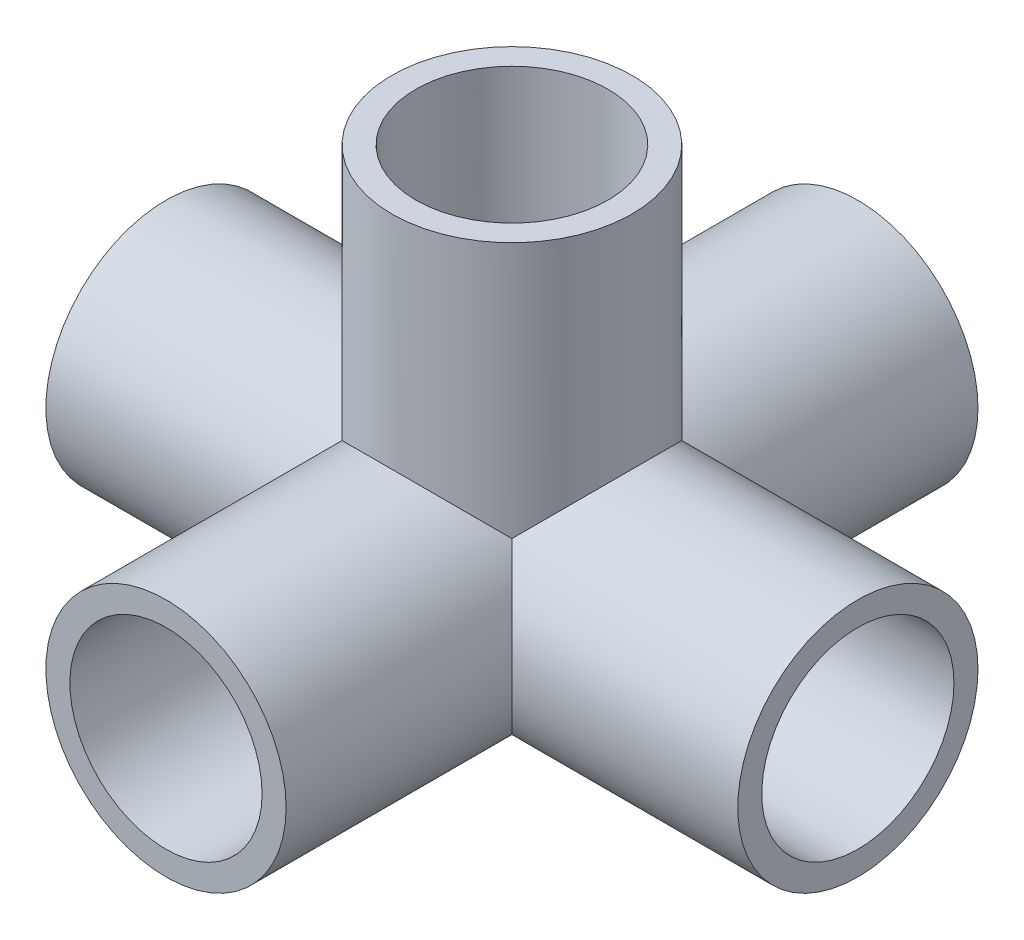
ISO-10303-21;
HEADER;
FILE_DESCRIPTION(('STEP AP214'),'2;1');
FILE_NAME('part.step','',(''),(''),'','','');
FILE_SCHEMA(('AUTOMOTIVE_DESIGN { 1 0 10303 214 1 1 1 1 }'));
ENDSEC;
DATA;
#1=APPLICATION_CONTEXT('core data for automotive mechanical design processes');
#2=APPLICATION_PROTOCOL_DEFINITION('international standard','automotive_design',2000,#1);
#3=PRODUCT_CONTEXT('',#1,'mechanical');
#4=PRODUCT('Part','Part','',(#3));
#5=PRODUCT_RELATED_PRODUCT_CATEGORY('part','',(#4));
#6=PRODUCT_DEFINITION_FORMATION('','',#4);
#7=PRODUCT_DEFINITION_CONTEXT('part definition',#1,'design');
#8=PRODUCT_DEFINITION('design','',#6,#7);
#9=PRODUCT_DEFINITION_SHAPE('','',#8);
#10=(LENGTH_UNIT() NAMED_UNIT(*) SI_UNIT(.MILLI.,.METRE.));
#11=(NAMED_UNIT(*) PLANE_ANGLE_UNIT() SI_UNIT($,.RADIAN.));
#12=(NAMED_UNIT(*) SI_UNIT($,.STERADIAN.) SOLID_ANGLE_UNIT());
#13=UNCERTAINTY_MEASURE_WITH_UNIT(LENGTH_MEASURE(1.E-05),#10,'distance_accuracy_value','');
#14=(GEOMETRIC_REPRESENTATION_CONTEXT(3) GLOBAL_UNCERTAINTY_ASSIGNED_CONTEXT((#13)) GLOBAL_UNIT_ASSIGNED_CONTEXT((#10,
#11,#12)) REPRESENTATION_CONTEXT('',''));
#15=CARTESIAN_POINT('',(0.,0.,0.));
#16=DIRECTION('',(0.,0.,1.));
#17=DIRECTION('',(1.,0.,0.));
#18=AXIS2_PLACEMENT_3D('',#15,#16,#17);
#19=CARTESIAN_POINT('',(36.,0.,0.));
#20=DIRECTION('',(-1.,0.,0.));
#21=DIRECTION('',(0.,0.,1.));
#22=AXIS2_PLACEMENT_3D('',#19,#20,#21);
#23=CYLINDRICAL_SURFACE('',#22,12.5);
#24=CARTESIAN_POINT('',(-36.,0.,0.));
#25=DIRECTION('',(1.,0.,0.));
#26=DIRECTION('',(0.,0.,-1.));
#27=AXIS2_PLACEMENT_3D('',#24,#25,#26);
#28=CIRCLE('',#27,12.5);
#29=CARTESIAN_POINT('',(-36.,0.,-12.5));
#30=VERTEX_POINT('',#29);
#31=EDGE_CURVE('E132',#30,#30,#28,.T.);
#32=ORIENTED_EDGE('',*,*,#31,.T.);
#33=EDGE_LOOP('',(#32));
#34=FACE_BOUND('',#33,.T.);
#35=CARTESIAN_POINT('',(0.,0.,0.));
#36=DIRECTION('',(-0.707106781186547,0.,-0.707106781186547));
#37=DIRECTION('',(-0.707106781186547,0.,0.707106781186547));
#38=AXIS2_PLACEMENT_3D('',#35,#36,#37);
#39=ELLIPSE('',#38,17.6776695296637,12.5);
#40=CARTESIAN_POINT('',(-8.83883476483184,8.83883476483184,8.83883476483184));
#41=VERTEX_POINT('',#40);
#42=CARTESIAN_POINT('',(0.,-12.5,0.));
#43=VERTEX_POINT('',#42);
#44=EDGE_CURVE('E115',#41,#43,#39,.F.);
#45=ORIENTED_EDGE('',*,*,#44,.F.);
#46=CARTESIAN_POINT('',(0.,0.,0.));
#47=DIRECTION('',(-0.707106781186547,-0.707106781186547,0.));
#48=DIRECTION('',(-0.707106781186547,0.707106781186547,0.));
#49=AXIS2_PLACEMENT_3D('',#46,#47,#48);
#50=ELLIPSE('',#49,17.6776695296637,12.5);
#51=CARTESIAN_POINT('',(-8.83883476483184,8.83883476483184,-8.83883476483184));
#52=VERTEX_POINT('',#51);
#53=EDGE_CURVE('E69',#52,#41,#50,.F.);
#54=ORIENTED_EDGE('',*,*,#53,.F.);
#55=CARTESIAN_POINT('',(0.,0.,0.));
#56=DIRECTION('',(-0.707106781186547,0.,0.707106781186547));
#57=DIRECTION('',(-0.707106781186547,0.,-0.707106781186547));
#58=AXIS2_PLACEMENT_3D('',#55,#56,#57);
#59=ELLIPSE('',#58,17.6776695296637,12.5);
#60=EDGE_CURVE('E53',#43,#52,#59,.F.);
#61=ORIENTED_EDGE('',*,*,#60,.F.);
#62=EDGE_LOOP('',(#45,#54,#61));
#63=FACE_BOUND('',#62,.T.);
#64=ADVANCED_FACE('F34',(#34,#63),#23,.T.);
#65=CARTESIAN_POINT('',(36.,0.,0.));
#66=DIRECTION('',(1.,0.,0.));
#67=DIRECTION('',(0.,0.,-1.));
#68=AXIS2_PLACEMENT_3D('',#65,#66,#67);
#69=CIRCLE('',#68,12.5);
#70=CARTESIAN_POINT('',(36.,0.,-12.5));
#71=VERTEX_POINT('',#70);
#72=EDGE_CURVE('E126',#71,#71,#69,.T.);
#73=ORIENTED_EDGE('',*,*,#72,.F.);
#74=EDGE_LOOP('',(#73));
#75=FACE_BOUND('',#74,.T.);
#76=CARTESIAN_POINT('',(0.,0.,0.));
#77=DIRECTION('',(-0.707106781186547,0.,-0.707106781186547));
#78=DIRECTION('',(-0.707106781186547,0.,0.707106781186547));
#79=AXIS2_PLACEMENT_3D('',#76,#77,#78);
#80=ELLIPSE('',#79,17.6776695296637,12.5);
#81=CARTESIAN_POINT('',(8.83883476483184,8.83883476483184,-8.83883476483184));
#82=VERTEX_POINT('',#81);
#83=EDGE_CURVE('E118',#82,#43,#80,.T.);
#84=ORIENTED_EDGE('',*,*,#83,.F.);
#85=CARTESIAN_POINT('',(0.,0.,0.));
#86=DIRECTION('',(-0.707106781186547,0.707106781186547,0.));
#87=DIRECTION('',(-0.707106781186547,-0.707106781186547,0.));
#88=AXIS2_PLACEMENT_3D('',#85,#86,#87);
#89=ELLIPSE('',#88,17.6776695296637,12.5);
#90=CARTESIAN_POINT('',(8.83883476483184,8.83883476483184,8.83883476483184));
#91=VERTEX_POINT('',#90);
#92=EDGE_CURVE('E65',#91,#82,#89,.T.);
#93=ORIENTED_EDGE('',*,*,#92,.F.);
#94=CARTESIAN_POINT('',(0.,0.,0.));
#95=DIRECTION('',(-0.707106781186547,0.,0.707106781186547));
#96=DIRECTION('',(-0.707106781186547,0.,-0.707106781186547));
#97=AXIS2_PLACEMENT_3D('',#94,#95,#96);
#98=ELLIPSE('',#97,17.6776695296637,12.5);
#99=EDGE_CURVE('E124',#43,#91,#98,.T.);
#100=ORIENTED_EDGE('',*,*,#99,.F.);
#101=EDGE_LOOP('',(#84,#93,#100));
#102=FACE_BOUND('',#101,.T.);
#103=ADVANCED_FACE('F162',(#75,#102),#23,.T.);
#104=CARTESIAN_POINT('',(0.,35.5,0.));
#105=DIRECTION('',(0.,-1.,0.));
#106=DIRECTION('',(0.,0.,-1.));
#107=AXIS2_PLACEMENT_3D('',#104,#105,#106);
#108=CYLINDRICAL_SURFACE('',#107,12.5);
#109=CARTESIAN_POINT('',(0.,35.5,0.));
#110=DIRECTION('',(0.,1.,0.));
#111=DIRECTION('',(0.,0.,1.));
#112=AXIS2_PLACEMENT_3D('',#109,#110,#111);
#113=CIRCLE('',#112,12.5);
#114=CARTESIAN_POINT('',(0.,35.5,12.5));
#115=VERTEX_POINT('',#114);
#116=EDGE_CURVE('E121',#115,#115,#113,.T.);
#117=ORIENTED_EDGE('',*,*,#116,.F.);
#118=EDGE_LOOP('',(#117));
#119=FACE_BOUND('',#118,.T.);
#120=CARTESIAN_POINT('',(0.,0.,0.));
#121=DIRECTION('',(0.,-0.707106781186547,-0.707106781186547));
#122=DIRECTION('',(0.,-0.707106781186547,0.707106781186547));
#123=AXIS2_PLACEMENT_3D('',#120,#121,#122);
#124=ELLIPSE('',#123,17.6776695296637,12.5);
#125=EDGE_CURVE('E11',#52,#82,#124,.T.);
#126=ORIENTED_EDGE('',*,*,#125,.F.);
#127=ORIENTED_EDGE('',*,*,#53,.T.);
#128=CARTESIAN_POINT('',(0.,0.,0.));
#129=DIRECTION('',(0.,-0.707106781186547,0.707106781186547));
#130=DIRECTION('',(0.,-0.707106781186547,-0.707106781186547));
#131=AXIS2_PLACEMENT_3D('',#128,#129,#130);
#132=ELLIPSE('',#131,17.6776695296637,12.5);
#133=EDGE_CURVE('E44',#91,#41,#132,.T.);
#134=ORIENTED_EDGE('',*,*,#133,.F.);
#135=ORIENTED_EDGE('',*,*,#92,.T.);
#136=EDGE_LOOP('',(#126,#127,#134,#135));
#137=FACE_BOUND('',#136,.T.);
#138=ADVANCED_FACE('F168',(#119,#137),#108,.T.);
#139=CARTESIAN_POINT('',(36.,0.,0.));
#140=DIRECTION('',(1.,0.,0.));
#141=DIRECTION('',(0.,0.,-1.));
#142=AXIS2_PLACEMENT_3D('',#139,#140,#141);
#143=PLANE('',#142);
#144=CARTESIAN_POINT('',(36.,0.,0.));
#145=DIRECTION('',(1.,0.,0.));
#146=DIRECTION('',(0.,0.,-1.));
#147=AXIS2_PLACEMENT_3D('',#144,#145,#146);
#148=CIRCLE('',#147,10.);
#149=CARTESIAN_POINT('',(36.,0.,-10.));
#150=VERTEX_POINT('',#149);
#151=EDGE_CURVE('E220',#150,#150,#148,.T.);
#152=ORIENTED_EDGE('',*,*,#151,.F.);
#153=EDGE_LOOP('',(#152));
#154=FACE_BOUND('',#153,.T.);
#155=ORIENTED_EDGE('',*,*,#72,.T.);
#156=EDGE_LOOP('',(#155));
#157=FACE_BOUND('',#156,.T.);
#158=ADVANCED_FACE('F174',(#154,#157),#143,.T.);
#159=CARTESIAN_POINT('',(-36.,0.,0.));
#160=DIRECTION('',(1.,0.,0.));
#161=DIRECTION('',(0.,0.,-1.));
#162=AXIS2_PLACEMENT_3D('',#159,#160,#161);
#163=PLANE('',#162);
#164=CARTESIAN_POINT('',(-36.,0.,0.));
#165=DIRECTION('',(1.,0.,0.));
#166=DIRECTION('',(0.,0.,-1.));
#167=AXIS2_PLACEMENT_3D('',#164,#165,#166);
#168=CIRCLE('',#167,10.);
#169=CARTESIAN_POINT('',(-36.,0.,-10.));
#170=VERTEX_POINT('',#169);
#171=EDGE_CURVE('E219',#170,#170,#168,.T.);
#172=ORIENTED_EDGE('',*,*,#171,.T.);
#173=EDGE_LOOP('',(#172));
#174=FACE_BOUND('',#173,.T.);
#175=ORIENTED_EDGE('',*,*,#31,.F.);
#176=EDGE_LOOP('',(#175));
#177=FACE_BOUND('',#176,.T.);
#178=ADVANCED_FACE('F171',(#174,#177),#163,.F.);
#179=CARTESIAN_POINT('',(0.,35.5,0.));
#180=DIRECTION('',(0.,1.,0.));
#181=DIRECTION('',(0.,0.,1.));
#182=AXIS2_PLACEMENT_3D('',#179,#180,#181);
#183=PLANE('',#182);
#184=CARTESIAN_POINT('',(0.,35.5,0.));
#185=DIRECTION('',(0.,1.,0.));
#186=DIRECTION('',(0.,0.,1.));
#187=AXIS2_PLACEMENT_3D('',#184,#185,#186);
#188=CIRCLE('',#187,10.);
#189=CARTESIAN_POINT('',(0.,35.5,10.));
#190=VERTEX_POINT('',#189);
#191=EDGE_CURVE('E216',#190,#190,#188,.T.);
#192=ORIENTED_EDGE('',*,*,#191,.F.);
#193=EDGE_LOOP('',(#192));
#194=FACE_BOUND('',#193,.T.);
#195=ORIENTED_EDGE('',*,*,#116,.T.);
#196=EDGE_LOOP('',(#195));
#197=FACE_BOUND('',#196,.T.);
#198=ADVANCED_FACE('F189',(#194,#197),#183,.T.);
#199=CARTESIAN_POINT('',(0.,0.,36.));
#200=DIRECTION('',(0.,0.,1.));
#201=DIRECTION('',(1.,0.,0.));
#202=AXIS2_PLACEMENT_3D('',#199,#200,#201);
#203=PLANE('',#202);
#204=CARTESIAN_POINT('',(0.,0.,36.));
#205=DIRECTION('',(0.,0.,1.));
#206=DIRECTION('',(1.,0.,0.));
#207=AXIS2_PLACEMENT_3D('',#204,#205,#206);
#208=CIRCLE('',#207,10.);
#209=CARTESIAN_POINT('',(10.,0.,36.));
#210=VERTEX_POINT('',#209);
#211=EDGE_CURVE('E211',#210,#210,#208,.T.);
#212=ORIENTED_EDGE('',*,*,#211,.F.);
#213=EDGE_LOOP('',(#212));
#214=FACE_BOUND('',#213,.T.);
#215=CARTESIAN_POINT('',(0.,0.,36.));
#216=DIRECTION('',(0.,0.,1.));
#217=DIRECTION('',(1.,0.,0.));
#218=AXIS2_PLACEMENT_3D('',#215,#216,#217);
#219=CIRCLE('',#218,12.5);
#220=CARTESIAN_POINT('',(12.5,0.,36.));
#221=VERTEX_POINT('',#220);
#222=EDGE_CURVE('E128',#221,#221,#219,.T.);
#223=ORIENTED_EDGE('',*,*,#222,.T.);
#224=EDGE_LOOP('',(#223));
#225=FACE_BOUND('',#224,.T.);
#226=ADVANCED_FACE('F184',(#214,#225),#203,.T.);
#227=CARTESIAN_POINT('',(0.,0.,36.));
#228=DIRECTION('',(0.,0.,-1.));
#229=DIRECTION('',(-1.,0.,0.));
#230=AXIS2_PLACEMENT_3D('',#227,#228,#229);
#231=CYLINDRICAL_SURFACE('',#230,12.5);
#232=ORIENTED_EDGE('',*,*,#222,.F.);
#233=EDGE_LOOP('',(#232));
#234=FACE_BOUND('',#233,.T.);
#235=ORIENTED_EDGE('',*,*,#133,.T.);
#236=ORIENTED_EDGE('',*,*,#44,.T.);
#237=ORIENTED_EDGE('',*,*,#99,.T.);
#238=EDGE_LOOP('',(#235,#236,#237));
#239=FACE_BOUND('',#238,.T.);
#240=ADVANCED_FACE('F36',(#234,#239),#231,.T.);
#241=CARTESIAN_POINT('',(0.,0.,-36.));
#242=DIRECTION('',(0.,0.,1.));
#243=DIRECTION('',(1.,0.,0.));
#244=AXIS2_PLACEMENT_3D('',#241,#242,#243);
#245=CIRCLE('',#244,12.5);
#246=CARTESIAN_POINT('',(12.5,0.,-36.));
#247=VERTEX_POINT('',#246);
#248=EDGE_CURVE('E38',#247,#247,#245,.T.);
#249=ORIENTED_EDGE('',*,*,#248,.T.);
#250=EDGE_LOOP('',(#249));
#251=FACE_BOUND('',#250,.T.);
#252=ORIENTED_EDGE('',*,*,#83,.T.);
#253=ORIENTED_EDGE('',*,*,#60,.T.);
#254=ORIENTED_EDGE('',*,*,#125,.T.);
#255=EDGE_LOOP('',(#252,#253,#254));
#256=FACE_BOUND('',#255,.T.);
#257=ADVANCED_FACE('F144',(#251,#256),#231,.T.);
#258=CARTESIAN_POINT('',(0.,0.,-36.));
#259=DIRECTION('',(0.,0.,1.));
#260=DIRECTION('',(1.,0.,0.));
#261=AXIS2_PLACEMENT_3D('',#258,#259,#260);
#262=PLANE('',#261);
#263=CARTESIAN_POINT('',(0.,0.,-36.));
#264=DIRECTION('',(0.,0.,1.));
#265=DIRECTION('',(1.,0.,0.));
#266=AXIS2_PLACEMENT_3D('',#263,#264,#265);
#267=CIRCLE('',#266,10.);
#268=CARTESIAN_POINT('',(10.,0.,-36.));
#269=VERTEX_POINT('',#268);
#270=EDGE_CURVE('E208',#269,#269,#267,.T.);
#271=ORIENTED_EDGE('',*,*,#270,.T.);
#272=EDGE_LOOP('',(#271));
#273=FACE_BOUND('',#272,.T.);
#274=ORIENTED_EDGE('',*,*,#248,.F.);
#275=EDGE_LOOP('',(#274));
#276=FACE_BOUND('',#275,.T.);
#277=ADVANCED_FACE('F147',(#273,#276),#262,.F.);
#278=CARTESIAN_POINT('',(36.,0.,0.));
#279=DIRECTION('',(-1.,0.,0.));
#280=DIRECTION('',(0.,0.,1.));
#281=AXIS2_PLACEMENT_3D('',#278,#279,#280);
#282=CYLINDRICAL_SURFACE('',#281,10.);
#283=ORIENTED_EDGE('',*,*,#171,.F.);
#284=EDGE_LOOP('',(#283));
#285=FACE_BOUND('',#284,.T.);
#286=CARTESIAN_POINT('',(0.,0.,0.));
#287=DIRECTION('',(-0.707106781186547,0.,-0.707106781186547));
#288=DIRECTION('',(-0.707106781186547,0.,0.707106781186547));
#289=AXIS2_PLACEMENT_3D('',#286,#287,#288);
#290=ELLIPSE('',#289,14.1421356237309,10.);
#291=CARTESIAN_POINT('',(-7.07106781186547,7.07106781186547,7.07106781186547));
#292=VERTEX_POINT('',#291);
#293=CARTESIAN_POINT('',(0.,-10.,0.));
#294=VERTEX_POINT('',#293);
#295=EDGE_CURVE('E94',#292,#294,#290,.F.);
#296=ORIENTED_EDGE('',*,*,#295,.T.);
#297=CARTESIAN_POINT('',(0.,0.,0.));
#298=DIRECTION('',(-0.707106781186547,0.,0.707106781186547));
#299=DIRECTION('',(-0.707106781186547,0.,-0.707106781186547));
#300=AXIS2_PLACEMENT_3D('',#297,#298,#299);
#301=ELLIPSE('',#300,14.1421356237309,10.);
#302=CARTESIAN_POINT('',(-7.07106781186547,7.07106781186547,-7.07106781186547));
#303=VERTEX_POINT('',#302);
#304=EDGE_CURVE('E76',#294,#303,#301,.F.);
#305=ORIENTED_EDGE('',*,*,#304,.T.);
#306=CARTESIAN_POINT('',(0.,0.,0.));
#307=DIRECTION('',(-0.707106781186547,-0.707106781186547,0.));
#308=DIRECTION('',(-0.707106781186547,0.707106781186547,0.));
#309=AXIS2_PLACEMENT_3D('',#306,#307,#308);
#310=ELLIPSE('',#309,14.1421356237309,10.);
#311=EDGE_CURVE('E91',#303,#292,#310,.F.);
#312=ORIENTED_EDGE('',*,*,#311,.T.);
#313=EDGE_LOOP('',(#296,#305,#312));
#314=FACE_BOUND('',#313,.T.);
#315=ADVANCED_FACE('F93',(#285,#314),#282,.F.);
#316=ORIENTED_EDGE('',*,*,#151,.T.);
#317=EDGE_LOOP('',(#316));
#318=FACE_BOUND('',#317,.T.);
#319=CARTESIAN_POINT('',(0.,0.,0.));
#320=DIRECTION('',(-0.707106781186547,0.,-0.707106781186547));
#321=DIRECTION('',(-0.707106781186547,0.,0.707106781186547));
#322=AXIS2_PLACEMENT_3D('',#319,#320,#321);
#323=ELLIPSE('',#322,14.1421356237309,10.);
#324=CARTESIAN_POINT('',(7.07106781186547,7.07106781186547,-7.07106781186547));
#325=VERTEX_POINT('',#324);
#326=EDGE_CURVE('E107',#325,#294,#323,.T.);
#327=ORIENTED_EDGE('',*,*,#326,.T.);
#328=CARTESIAN_POINT('',(0.,0.,0.));
#329=DIRECTION('',(-0.707106781186547,0.,0.707106781186547));
#330=DIRECTION('',(-0.707106781186547,0.,-0.707106781186547));
#331=AXIS2_PLACEMENT_3D('',#328,#329,#330);
#332=ELLIPSE('',#331,14.1421356237309,10.);
#333=CARTESIAN_POINT('',(7.07106781186547,7.07106781186547,7.07106781186547));
#334=VERTEX_POINT('',#333);
#335=EDGE_CURVE('E106',#294,#334,#332,.T.);
#336=ORIENTED_EDGE('',*,*,#335,.T.);
#337=CARTESIAN_POINT('',(0.,0.,0.));
#338=DIRECTION('',(-0.707106781186547,0.707106781186547,0.));
#339=DIRECTION('',(-0.707106781186547,-0.707106781186547,0.));
#340=AXIS2_PLACEMENT_3D('',#337,#338,#339);
#341=ELLIPSE('',#340,14.1421356237309,10.);
#342=EDGE_CURVE('E100',#334,#325,#341,.T.);
#343=ORIENTED_EDGE('',*,*,#342,.T.);
#344=EDGE_LOOP('',(#327,#336,#343));
#345=FACE_BOUND('',#344,.T.);
#346=ADVANCED_FACE('F155',(#318,#345),#282,.F.);
#347=CARTESIAN_POINT('',(0.,35.5,0.));
#348=DIRECTION('',(0.,-1.,0.));
#349=DIRECTION('',(0.,0.,-1.));
#350=AXIS2_PLACEMENT_3D('',#347,#348,#349);
#351=CYLINDRICAL_SURFACE('',#350,10.);
#352=ORIENTED_EDGE('',*,*,#191,.T.);
#353=EDGE_LOOP('',(#352));
#354=FACE_BOUND('',#353,.T.);
#355=CARTESIAN_POINT('',(0.,0.,0.));
#356=DIRECTION('',(0.,-0.707106781186547,-0.707106781186547));
#357=DIRECTION('',(0.,-0.707106781186547,0.707106781186547));
#358=AXIS2_PLACEMENT_3D('',#355,#356,#357);
#359=ELLIPSE('',#358,14.1421356237309,10.);
#360=EDGE_CURVE('E110',#303,#325,#359,.T.);
#361=ORIENTED_EDGE('',*,*,#360,.T.);
#362=ORIENTED_EDGE('',*,*,#342,.F.);
#363=CARTESIAN_POINT('',(0.,0.,0.));
#364=DIRECTION('',(0.,-0.707106781186547,0.707106781186547));
#365=DIRECTION('',(0.,-0.707106781186547,-0.707106781186547));
#366=AXIS2_PLACEMENT_3D('',#363,#364,#365);
#367=ELLIPSE('',#366,14.1421356237309,10.);
#368=EDGE_CURVE('E99',#334,#292,#367,.T.);
#369=ORIENTED_EDGE('',*,*,#368,.T.);
#370=ORIENTED_EDGE('',*,*,#311,.F.);
#371=EDGE_LOOP('',(#361,#362,#369,#370));
#372=FACE_BOUND('',#371,.T.);
#373=ADVANCED_FACE('F109',(#354,#372),#351,.F.);
#374=CARTESIAN_POINT('',(0.,0.,36.));
#375=DIRECTION('',(0.,0.,-1.));
#376=DIRECTION('',(-1.,0.,0.));
#377=AXIS2_PLACEMENT_3D('',#374,#375,#376);
#378=CYLINDRICAL_SURFACE('',#377,10.);
#379=ORIENTED_EDGE('',*,*,#211,.T.);
#380=EDGE_LOOP('',(#379));
#381=FACE_BOUND('',#380,.T.);
#382=ORIENTED_EDGE('',*,*,#368,.F.);
#383=ORIENTED_EDGE('',*,*,#335,.F.);
#384=ORIENTED_EDGE('',*,*,#295,.F.);
#385=EDGE_LOOP('',(#382,#383,#384));
#386=FACE_BOUND('',#385,.T.);
#387=ADVANCED_FACE('F103',(#381,#386),#378,.F.);
#388=ORIENTED_EDGE('',*,*,#270,.F.);
#389=EDGE_LOOP('',(#388));
#390=FACE_BOUND('',#389,.T.);
#391=ORIENTED_EDGE('',*,*,#326,.F.);
#392=ORIENTED_EDGE('',*,*,#360,.F.);
#393=ORIENTED_EDGE('',*,*,#304,.F.);
#394=EDGE_LOOP('',(#391,#392,#393));
#395=FACE_BOUND('',#394,.T.);
#396=ADVANCED_FACE('F200',(#390,#395),#378,.F.);
#397=CLOSED_SHELL('',(#64,#103,#138,#158,#178,#198,#226,#240,#257,#277,#315,#346,#373,#387,#396));
#398=MANIFOLD_SOLID_BREP('B2',#397);
#399=ADVANCED_BREP_SHAPE_REPRESENTATION('',(#18,#398),#14);
#400=SHAPE_DEFINITION_REPRESENTATION(#9,#399);
ENDSEC;
END-ISO-10303-21;
